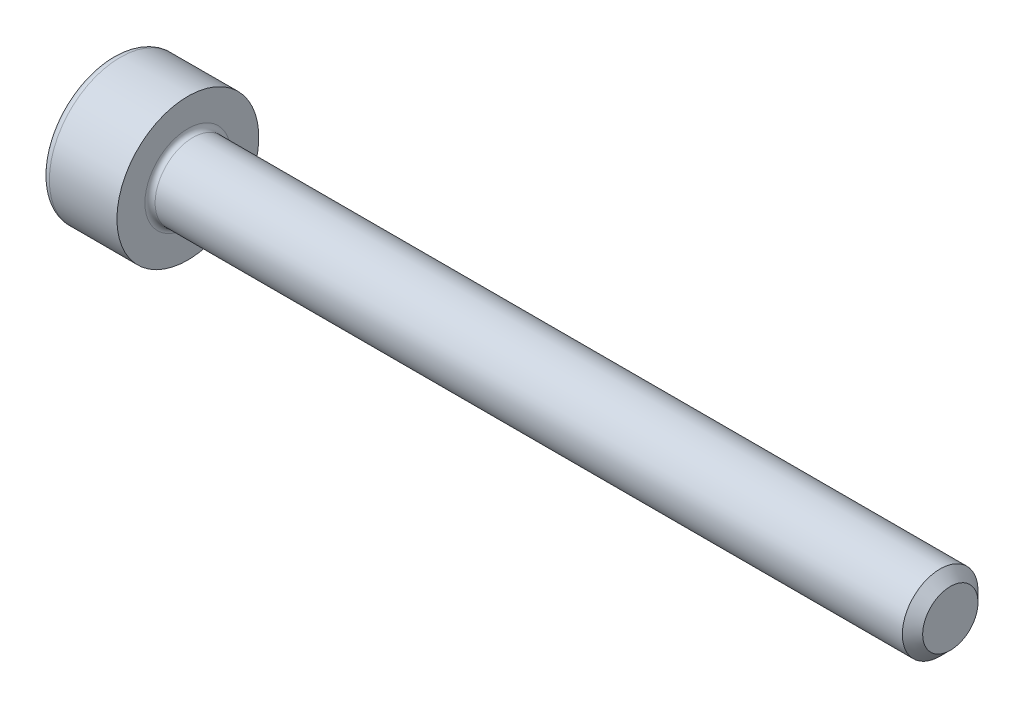
ISO-10303-21;
HEADER;
FILE_DESCRIPTION(('STEP AP214'),'2;1');
FILE_NAME('part.step','',(''),(''),'','','');
FILE_SCHEMA(('AUTOMOTIVE_DESIGN { 1 0 10303 214 1 1 1 1 }'));
ENDSEC;
DATA;
#1=APPLICATION_CONTEXT('core data for automotive mechanical design processes');
#2=APPLICATION_PROTOCOL_DEFINITION('international standard','automotive_design',2000,#1);
#3=PRODUCT_CONTEXT('',#1,'mechanical');
#4=PRODUCT('Part','Part','',(#3));
#5=PRODUCT_RELATED_PRODUCT_CATEGORY('part','',(#4));
#6=PRODUCT_DEFINITION_FORMATION('','',#4);
#7=PRODUCT_DEFINITION_CONTEXT('part definition',#1,'design');
#8=PRODUCT_DEFINITION('design','',#6,#7);
#9=PRODUCT_DEFINITION_SHAPE('','',#8);
#10=(LENGTH_UNIT() NAMED_UNIT(*) SI_UNIT(.MILLI.,.METRE.));
#11=(NAMED_UNIT(*) PLANE_ANGLE_UNIT() SI_UNIT($,.RADIAN.));
#12=(NAMED_UNIT(*) SI_UNIT($,.STERADIAN.) SOLID_ANGLE_UNIT());
#13=UNCERTAINTY_MEASURE_WITH_UNIT(LENGTH_MEASURE(1.E-05),#10,'distance_accuracy_value','');
#14=(GEOMETRIC_REPRESENTATION_CONTEXT(3) GLOBAL_UNCERTAINTY_ASSIGNED_CONTEXT((#13)) GLOBAL_UNIT_ASSIGNED_CONTEXT((#10,
#11,#12)) REPRESENTATION_CONTEXT('',''));
#15=CARTESIAN_POINT('',(0.,0.,0.));
#16=DIRECTION('',(0.,0.,1.));
#17=DIRECTION('',(1.,0.,0.));
#18=AXIS2_PLACEMENT_3D('',#15,#16,#17);
#19=CARTESIAN_POINT('',(0.,0.,0.));
#20=DIRECTION('',(-1.,0.,0.));
#21=DIRECTION('',(0.,0.,1.));
#22=AXIS2_PLACEMENT_3D('',#19,#20,#21);
#23=CYLINDRICAL_SURFACE('',#22,1.39568824458778);
#24=CARTESIAN_POINT('',(0.16,0.,0.));
#25=DIRECTION('',(1.,0.,0.));
#26=DIRECTION('',(0.,0.,-1.));
#27=AXIS2_PLACEMENT_3D('',#24,#25,#26);
#28=CIRCLE('',#27,1.39568824458778);
#29=CARTESIAN_POINT('',(0.16,0.,-1.39568824458778));
#30=VERTEX_POINT('',#29);
#31=EDGE_CURVE('E158',#30,#30,#28,.T.);
#32=ORIENTED_EDGE('',*,*,#31,.T.);
#33=EDGE_LOOP('',(#32));
#34=FACE_BOUND('',#33,.T.);
#35=CARTESIAN_POINT('',(1.48873412756029,0.,0.));
#36=DIRECTION('',(-1.,0.,0.));
#37=DIRECTION('',(0.,0.,1.));
#38=AXIS2_PLACEMENT_3D('',#35,#36,#37);
#39=CIRCLE('',#38,1.39568824458778);
#40=CARTESIAN_POINT('',(1.48873412756029,0.,1.39568824458778));
#41=VERTEX_POINT('',#40);
#42=EDGE_CURVE('E141',#41,#41,#39,.T.);
#43=ORIENTED_EDGE('',*,*,#42,.T.);
#44=EDGE_LOOP('',(#43));
#45=FACE_BOUND('',#44,.T.);
#46=ADVANCED_FACE('F39',(#34,#45),#23,.T.);
#47=CARTESIAN_POINT('',(0.,0.,0.));
#48=DIRECTION('',(1.,0.,0.));
#49=DIRECTION('',(0.,0.,-1.));
#50=AXIS2_PLACEMENT_3D('',#47,#48,#49);
#51=PLANE('',#50);
#52=DIRECTION('',(0.,-0.5,-0.866025403784439));
#53=VECTOR('',#52,1.);
#54=CARTESIAN_POINT('',(0.,0.877572409168232,0.));
#55=LINE('',#54,#53);
#56=CARTESIAN_POINT('',(0.,0.877572409168232,0.));
#57=VERTEX_POINT('',#56);
#58=CARTESIAN_POINT('',(0.,0.438786204584116,-0.760000000000001));
#59=VERTEX_POINT('',#58);
#60=EDGE_CURVE('E128',#57,#59,#55,.T.);
#61=ORIENTED_EDGE('',*,*,#60,.F.);
#62=DIRECTION('',(0.,0.5,-0.866025403784439));
#63=VECTOR('',#62,1.);
#64=CARTESIAN_POINT('',(0.,0.438786204584116,0.76));
#65=LINE('',#64,#63);
#66=CARTESIAN_POINT('',(0.,0.438786204584116,0.76));
#67=VERTEX_POINT('',#66);
#68=EDGE_CURVE('E54',#67,#57,#65,.T.);
#69=ORIENTED_EDGE('',*,*,#68,.F.);
#70=DIRECTION('',(0.,1.,0.));
#71=VECTOR('',#70,1.);
#72=CARTESIAN_POINT('',(0.,-0.438786204584116,0.76));
#73=LINE('',#72,#71);
#74=CARTESIAN_POINT('',(0.,-0.438786204584116,0.76));
#75=VERTEX_POINT('',#74);
#76=EDGE_CURVE('E137',#75,#67,#73,.T.);
#77=ORIENTED_EDGE('',*,*,#76,.F.);
#78=DIRECTION('',(0.,0.5,0.866025403784439));
#79=VECTOR('',#78,1.);
#80=CARTESIAN_POINT('',(0.,-0.877572409168232,0.));
#81=LINE('',#80,#79);
#82=CARTESIAN_POINT('',(0.,-0.877572409168232,0.));
#83=VERTEX_POINT('',#82);
#84=EDGE_CURVE('E135',#83,#75,#81,.T.);
#85=ORIENTED_EDGE('',*,*,#84,.F.);
#86=DIRECTION('',(0.,-0.5,0.866025403784438));
#87=VECTOR('',#86,1.);
#88=CARTESIAN_POINT('',(0.,-0.438786204584116,-0.760000000000001));
#89=LINE('',#88,#87);
#90=CARTESIAN_POINT('',(0.,-0.438786204584116,-0.760000000000001));
#91=VERTEX_POINT('',#90);
#92=EDGE_CURVE('E102',#91,#83,#89,.T.);
#93=ORIENTED_EDGE('',*,*,#92,.F.);
#94=DIRECTION('',(0.,-1.,0.));
#95=VECTOR('',#94,1.);
#96=CARTESIAN_POINT('',(0.,0.438786204584116,-0.760000000000001));
#97=LINE('',#96,#95);
#98=EDGE_CURVE('E131',#59,#91,#97,.T.);
#99=ORIENTED_EDGE('',*,*,#98,.F.);
#100=EDGE_LOOP('',(#61,#69,#77,#85,#93,#99));
#101=FACE_BOUND('',#100,.T.);
#102=CARTESIAN_POINT('',(0.,0.,0.));
#103=DIRECTION('',(1.,0.,0.));
#104=DIRECTION('',(0.,0.,-1.));
#105=AXIS2_PLACEMENT_3D('',#102,#103,#104);
#106=CIRCLE('',#105,1.23568824458778);
#107=CARTESIAN_POINT('',(0.,0.,-1.23568824458778));
#108=VERTEX_POINT('',#107);
#109=EDGE_CURVE('E155',#108,#108,#106,.F.);
#110=ORIENTED_EDGE('',*,*,#109,.T.);
#111=EDGE_LOOP('',(#110));
#112=FACE_BOUND('',#111,.T.);
#113=ADVANCED_FACE('F180',(#101,#112),#51,.F.);
#114=CARTESIAN_POINT('',(16.4887341275603,0.,0.));
#115=DIRECTION('',(-1.,0.,0.));
#116=DIRECTION('',(0.,0.,1.));
#117=AXIS2_PLACEMENT_3D('',#114,#115,#116);
#118=PLANE('',#117);
#119=CARTESIAN_POINT('',(16.4887341275603,0.,0.));
#120=DIRECTION('',(-1.,0.,0.));
#121=DIRECTION('',(0.,0.,1.));
#122=AXIS2_PLACEMENT_3D('',#119,#120,#121);
#123=CIRCLE('',#122,0.544367063780147);
#124=CARTESIAN_POINT('',(16.4887341275603,0.,0.544367063780147));
#125=VERTEX_POINT('',#124);
#126=EDGE_CURVE('E11',#125,#125,#123,.F.);
#127=ORIENTED_EDGE('',*,*,#126,.T.);
#128=EDGE_LOOP('',(#127));
#129=FACE_BOUND('',#128,.T.);
#130=ADVANCED_FACE('F186',(#129),#118,.F.);
#131=CARTESIAN_POINT('',(0.,0.,0.));
#132=DIRECTION('',(-1.,0.,0.));
#133=DIRECTION('',(0.,0.,1.));
#134=AXIS2_PLACEMENT_3D('',#131,#132,#133);
#135=CYLINDRICAL_SURFACE('',#134,0.744367063780147);
#136=CARTESIAN_POINT('',(16.2887341275603,0.,0.));
#137=DIRECTION('',(-1.,0.,0.));
#138=DIRECTION('',(0.,0.,1.));
#139=AXIS2_PLACEMENT_3D('',#136,#137,#138);
#140=CIRCLE('',#139,0.744367063780147);
#141=CARTESIAN_POINT('',(16.2887341275603,0.,0.744367063780147));
#142=VERTEX_POINT('',#141);
#143=EDGE_CURVE('E47',#142,#142,#140,.T.);
#144=ORIENTED_EDGE('',*,*,#143,.T.);
#145=EDGE_LOOP('',(#144));
#146=FACE_BOUND('',#145,.T.);
#147=CARTESIAN_POINT('',(1.58873412756029,0.,0.));
#148=DIRECTION('',(-1.,0.,0.));
#149=DIRECTION('',(0.,0.,1.));
#150=AXIS2_PLACEMENT_3D('',#147,#148,#149);
#151=CIRCLE('',#150,0.744367063780147);
#152=CARTESIAN_POINT('',(1.58873412756029,0.,0.744367063780147));
#153=VERTEX_POINT('',#152);
#154=EDGE_CURVE('E152',#153,#153,#151,.F.);
#155=ORIENTED_EDGE('',*,*,#154,.T.);
#156=EDGE_LOOP('',(#155));
#157=FACE_BOUND('',#156,.T.);
#158=ADVANCED_FACE('F163',(#146,#157),#135,.T.);
#159=CARTESIAN_POINT('',(1.48873412756029,0.,0.));
#160=DIRECTION('',(-1.,0.,0.));
#161=DIRECTION('',(0.,0.,1.));
#162=AXIS2_PLACEMENT_3D('',#159,#160,#161);
#163=PLANE('',#162);
#164=CARTESIAN_POINT('',(1.48873412756029,0.,0.));
#165=DIRECTION('',(-1.,0.,0.));
#166=DIRECTION('',(0.,0.,1.));
#167=AXIS2_PLACEMENT_3D('',#164,#165,#166);
#168=CIRCLE('',#167,0.844367063780147);
#169=CARTESIAN_POINT('',(1.48873412756029,0.,0.844367063780147));
#170=VERTEX_POINT('',#169);
#171=EDGE_CURVE('E149',#170,#170,#168,.T.);
#172=ORIENTED_EDGE('',*,*,#171,.T.);
#173=EDGE_LOOP('',(#172));
#174=FACE_BOUND('',#173,.T.);
#175=ORIENTED_EDGE('',*,*,#42,.F.);
#176=EDGE_LOOP('',(#175));
#177=FACE_BOUND('',#176,.T.);
#178=ADVANCED_FACE('F193',(#174,#177),#163,.F.);
#179=CARTESIAN_POINT('',(1.58873412756029,0.,0.));
#180=DIRECTION('',(-1.,0.,0.));
#181=DIRECTION('',(0.,0.,1.));
#182=AXIS2_PLACEMENT_3D('',#179,#180,#181);
#183=TOROIDAL_SURFACE('',#182,0.844367063780147,0.1);
#184=ORIENTED_EDGE('',*,*,#154,.F.);
#185=EDGE_LOOP('',(#184));
#186=FACE_BOUND('',#185,.T.);
#187=ORIENTED_EDGE('',*,*,#171,.F.);
#188=EDGE_LOOP('',(#187));
#189=FACE_BOUND('',#188,.T.);
#190=ADVANCED_FACE('F176',(#186,#189),#183,.F.);
#191=CARTESIAN_POINT('',(0.16,0.,0.));
#192=DIRECTION('',(1.,0.,0.));
#193=DIRECTION('',(0.,0.,-1.));
#194=AXIS2_PLACEMENT_3D('',#191,#192,#193);
#195=TOROIDAL_SURFACE('',#194,1.23568824458778,0.16);
#196=ORIENTED_EDGE('',*,*,#31,.F.);
#197=EDGE_LOOP('',(#196));
#198=FACE_BOUND('',#197,.T.);
#199=ORIENTED_EDGE('',*,*,#109,.F.);
#200=EDGE_LOOP('',(#199));
#201=FACE_BOUND('',#200,.T.);
#202=ADVANCED_FACE('F168',(#198,#201),#195,.T.);
#203=CARTESIAN_POINT('',(16.2887341275603,0.,0.));
#204=DIRECTION('',(-1.,0.,0.));
#205=DIRECTION('',(0.,0.,1.));
#206=AXIS2_PLACEMENT_3D('',#203,#204,#205);
#207=CONICAL_SURFACE('',#206,0.744367063780147,0.785398163397445);
#208=ORIENTED_EDGE('',*,*,#126,.F.);
#209=EDGE_LOOP('',(#208));
#210=FACE_BOUND('',#209,.T.);
#211=ORIENTED_EDGE('',*,*,#143,.F.);
#212=EDGE_LOOP('',(#211));
#213=FACE_BOUND('',#212,.T.);
#214=ADVANCED_FACE('F41',(#210,#213),#207,.T.);
#215=CARTESIAN_POINT('',(0.7,0.438786204584116,0.76));
#216=DIRECTION('',(0.,0.866025403784439,0.5));
#217=DIRECTION('',(0.,-0.5,0.866025403784439));
#218=AXIS2_PLACEMENT_3D('',#215,#216,#217);
#219=PLANE('',#218);
#220=ORIENTED_EDGE('',*,*,#68,.T.);
#221=DIRECTION('',(-1.,0.,0.));
#222=VECTOR('',#221,1.);
#223=CARTESIAN_POINT('',(0.7,0.877572409168232,0.));
#224=LINE('',#223,#222);
#225=CARTESIAN_POINT('',(0.7,0.877572409168232,0.));
#226=VERTEX_POINT('',#225);
#227=EDGE_CURVE('E84',#226,#57,#224,.T.);
#228=ORIENTED_EDGE('',*,*,#227,.F.);
#229=DIRECTION('',(0.,0.5,-0.866025403784439));
#230=VECTOR('',#229,1.);
#231=CARTESIAN_POINT('',(0.7,0.438786204584116,0.76));
#232=LINE('',#231,#230);
#233=CARTESIAN_POINT('',(0.7,0.438786204584116,0.76));
#234=VERTEX_POINT('',#233);
#235=EDGE_CURVE('E139',#234,#226,#232,.T.);
#236=ORIENTED_EDGE('',*,*,#235,.F.);
#237=DIRECTION('',(-1.,0.,0.));
#238=VECTOR('',#237,1.);
#239=CARTESIAN_POINT('',(0.7,0.438786204584116,0.76));
#240=LINE('',#239,#238);
#241=EDGE_CURVE('E62',#234,#67,#240,.T.);
#242=ORIENTED_EDGE('',*,*,#241,.T.);
#243=EDGE_LOOP('',(#220,#228,#236,#242));
#244=FACE_BOUND('',#243,.T.);
#245=ADVANCED_FACE('F167',(#244),#219,.F.);
#246=CARTESIAN_POINT('',(0.7,-0.438786204584116,0.76));
#247=DIRECTION('',(0.,0.,1.));
#248=DIRECTION('',(1.,0.,0.));
#249=AXIS2_PLACEMENT_3D('',#246,#247,#248);
#250=PLANE('',#249);
#251=ORIENTED_EDGE('',*,*,#76,.T.);
#252=ORIENTED_EDGE('',*,*,#241,.F.);
#253=DIRECTION('',(0.,1.,0.));
#254=VECTOR('',#253,1.);
#255=CARTESIAN_POINT('',(0.7,-0.438786204584116,0.76));
#256=LINE('',#255,#254);
#257=CARTESIAN_POINT('',(0.7,-0.438786204584116,0.76));
#258=VERTEX_POINT('',#257);
#259=EDGE_CURVE('E114',#258,#234,#256,.T.);
#260=ORIENTED_EDGE('',*,*,#259,.F.);
#261=DIRECTION('',(-1.,0.,0.));
#262=VECTOR('',#261,1.);
#263=CARTESIAN_POINT('',(0.7,-0.438786204584116,0.76));
#264=LINE('',#263,#262);
#265=EDGE_CURVE('E106',#258,#75,#264,.T.);
#266=ORIENTED_EDGE('',*,*,#265,.T.);
#267=EDGE_LOOP('',(#251,#252,#260,#266));
#268=FACE_BOUND('',#267,.T.);
#269=ADVANCED_FACE('F174',(#268),#250,.F.);
#270=CARTESIAN_POINT('',(0.7,-0.877572409168232,0.));
#271=DIRECTION('',(0.,-0.866025403784439,0.5));
#272=DIRECTION('',(0.,-0.5,-0.866025403784439));
#273=AXIS2_PLACEMENT_3D('',#270,#271,#272);
#274=PLANE('',#273);
#275=ORIENTED_EDGE('',*,*,#84,.T.);
#276=ORIENTED_EDGE('',*,*,#265,.F.);
#277=DIRECTION('',(0.,0.5,0.866025403784439));
#278=VECTOR('',#277,1.);
#279=CARTESIAN_POINT('',(0.7,-0.877572409168232,0.));
#280=LINE('',#279,#278);
#281=CARTESIAN_POINT('',(0.7,-0.877572409168232,0.));
#282=VERTEX_POINT('',#281);
#283=EDGE_CURVE('E110',#282,#258,#280,.T.);
#284=ORIENTED_EDGE('',*,*,#283,.F.);
#285=DIRECTION('',(-1.,0.,0.));
#286=VECTOR('',#285,1.);
#287=CARTESIAN_POINT('',(0.7,-0.877572409168232,0.));
#288=LINE('',#287,#286);
#289=EDGE_CURVE('E95',#282,#83,#288,.T.);
#290=ORIENTED_EDGE('',*,*,#289,.T.);
#291=EDGE_LOOP('',(#275,#276,#284,#290));
#292=FACE_BOUND('',#291,.T.);
#293=ADVANCED_FACE('F111',(#292),#274,.F.);
#294=CARTESIAN_POINT('',(0.7,-0.438786204584116,-0.760000000000001));
#295=DIRECTION('',(0.,-0.866025403784438,-0.5));
#296=DIRECTION('',(0.,0.5,-0.866025403784438));
#297=AXIS2_PLACEMENT_3D('',#294,#295,#296);
#298=PLANE('',#297);
#299=ORIENTED_EDGE('',*,*,#92,.T.);
#300=ORIENTED_EDGE('',*,*,#289,.F.);
#301=DIRECTION('',(0.,-0.5,0.866025403784438));
#302=VECTOR('',#301,1.);
#303=CARTESIAN_POINT('',(0.7,-0.438786204584116,-0.760000000000001));
#304=LINE('',#303,#302);
#305=CARTESIAN_POINT('',(0.7,-0.438786204584116,-0.760000000000001));
#306=VERTEX_POINT('',#305);
#307=EDGE_CURVE('E99',#306,#282,#304,.T.);
#308=ORIENTED_EDGE('',*,*,#307,.F.);
#309=DIRECTION('',(-1.,0.,0.));
#310=VECTOR('',#309,1.);
#311=CARTESIAN_POINT('',(0.7,-0.438786204584116,-0.760000000000001));
#312=LINE('',#311,#310);
#313=EDGE_CURVE('E107',#306,#91,#312,.T.);
#314=ORIENTED_EDGE('',*,*,#313,.T.);
#315=EDGE_LOOP('',(#299,#300,#308,#314));
#316=FACE_BOUND('',#315,.T.);
#317=ADVANCED_FACE('F97',(#316),#298,.F.);
#318=CARTESIAN_POINT('',(0.7,0.438786204584116,-0.760000000000001));
#319=DIRECTION('',(0.,0.,-1.));
#320=DIRECTION('',(0.,1.,0.));
#321=AXIS2_PLACEMENT_3D('',#318,#319,#320);
#322=PLANE('',#321);
#323=ORIENTED_EDGE('',*,*,#98,.T.);
#324=ORIENTED_EDGE('',*,*,#313,.F.);
#325=DIRECTION('',(0.,-1.,0.));
#326=VECTOR('',#325,1.);
#327=CARTESIAN_POINT('',(0.7,0.438786204584116,-0.760000000000001));
#328=LINE('',#327,#326);
#329=CARTESIAN_POINT('',(0.7,0.438786204584116,-0.760000000000001));
#330=VERTEX_POINT('',#329);
#331=EDGE_CURVE('E120',#330,#306,#328,.T.);
#332=ORIENTED_EDGE('',*,*,#331,.F.);
#333=DIRECTION('',(-1.,0.,0.));
#334=VECTOR('',#333,1.);
#335=CARTESIAN_POINT('',(0.7,0.438786204584116,-0.760000000000001));
#336=LINE('',#335,#334);
#337=EDGE_CURVE('E144',#330,#59,#336,.T.);
#338=ORIENTED_EDGE('',*,*,#337,.T.);
#339=EDGE_LOOP('',(#323,#324,#332,#338));
#340=FACE_BOUND('',#339,.T.);
#341=ADVANCED_FACE('F215',(#340),#322,.F.);
#342=CARTESIAN_POINT('',(0.7,0.877572409168232,0.));
#343=DIRECTION('',(0.,0.866025403784439,-0.5));
#344=DIRECTION('',(0.,0.5,0.866025403784439));
#345=AXIS2_PLACEMENT_3D('',#342,#343,#344);
#346=PLANE('',#345);
#347=ORIENTED_EDGE('',*,*,#60,.T.);
#348=ORIENTED_EDGE('',*,*,#337,.F.);
#349=DIRECTION('',(0.,-0.5,-0.866025403784439));
#350=VECTOR('',#349,1.);
#351=CARTESIAN_POINT('',(0.7,0.877572409168232,0.));
#352=LINE('',#351,#350);
#353=EDGE_CURVE('E122',#226,#330,#352,.T.);
#354=ORIENTED_EDGE('',*,*,#353,.F.);
#355=ORIENTED_EDGE('',*,*,#227,.T.);
#356=EDGE_LOOP('',(#347,#348,#354,#355));
#357=FACE_BOUND('',#356,.T.);
#358=ADVANCED_FACE('F212',(#357),#346,.F.);
#359=CARTESIAN_POINT('',(0.7,0.,0.));
#360=DIRECTION('',(-1.,0.,0.));
#361=DIRECTION('',(0.,0.,1.));
#362=AXIS2_PLACEMENT_3D('',#359,#360,#361);
#363=PLANE('',#362);
#364=ORIENTED_EDGE('',*,*,#235,.T.);
#365=ORIENTED_EDGE('',*,*,#353,.T.);
#366=ORIENTED_EDGE('',*,*,#331,.T.);
#367=ORIENTED_EDGE('',*,*,#307,.T.);
#368=ORIENTED_EDGE('',*,*,#283,.T.);
#369=ORIENTED_EDGE('',*,*,#259,.T.);
#370=EDGE_LOOP('',(#364,#365,#366,#367,#368,#369));
#371=FACE_BOUND('',#370,.T.);
#372=ADVANCED_FACE('F117',(#371),#363,.T.);
#373=CLOSED_SHELL('',(#46,#113,#130,#158,#178,#190,#202,#214,#245,#269,#293,#317,#341,#358,#372));
#374=MANIFOLD_SOLID_BREP('B2',#373);
#375=ADVANCED_BREP_SHAPE_REPRESENTATION('',(#18,#374),#14);
#376=SHAPE_DEFINITION_REPRESENTATION(#9,#375);
ENDSEC;
END-ISO-10303-21;
